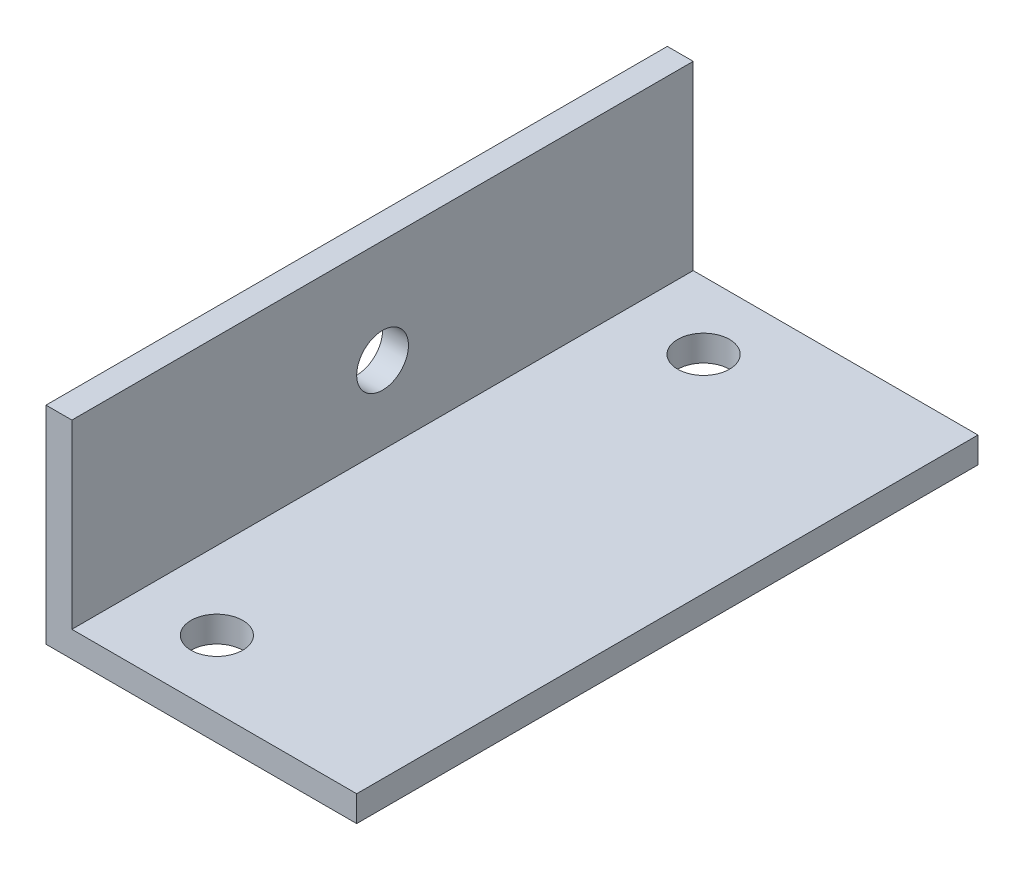
ISO-10303-21;
HEADER;
FILE_DESCRIPTION(('STEP AP214'),'2;1');
FILE_NAME('part.step','',(''),(''),'','','');
FILE_SCHEMA(('AUTOMOTIVE_DESIGN { 1 0 10303 214 1 1 1 1 }'));
ENDSEC;
DATA;
#1=APPLICATION_CONTEXT('core data for automotive mechanical design processes');
#2=APPLICATION_PROTOCOL_DEFINITION('international standard','automotive_design',2000,#1);
#3=PRODUCT_CONTEXT('',#1,'mechanical');
#4=PRODUCT('Part','Part','',(#3));
#5=PRODUCT_RELATED_PRODUCT_CATEGORY('part','',(#4));
#6=PRODUCT_DEFINITION_FORMATION('','',#4);
#7=PRODUCT_DEFINITION_CONTEXT('part definition',#1,'design');
#8=PRODUCT_DEFINITION('design','',#6,#7);
#9=PRODUCT_DEFINITION_SHAPE('','',#8);
#10=(LENGTH_UNIT() NAMED_UNIT(*) SI_UNIT(.MILLI.,.METRE.));
#11=(NAMED_UNIT(*) PLANE_ANGLE_UNIT() SI_UNIT($,.RADIAN.));
#12=(NAMED_UNIT(*) SI_UNIT($,.STERADIAN.) SOLID_ANGLE_UNIT());
#13=UNCERTAINTY_MEASURE_WITH_UNIT(LENGTH_MEASURE(1.E-05),#10,'distance_accuracy_value','');
#14=(GEOMETRIC_REPRESENTATION_CONTEXT(3) GLOBAL_UNCERTAINTY_ASSIGNED_CONTEXT((#13)) GLOBAL_UNIT_ASSIGNED_CONTEXT((#10,
#11,#12)) REPRESENTATION_CONTEXT('',''));
#15=CARTESIAN_POINT('',(0.,0.,0.));
#16=DIRECTION('',(0.,0.,1.));
#17=DIRECTION('',(1.,0.,0.));
#18=AXIS2_PLACEMENT_3D('',#15,#16,#17);
#19=CARTESIAN_POINT('',(0.,12.7,38.1));
#20=DIRECTION('',(0.,-1.,0.));
#21=DIRECTION('',(0.,0.,-1.));
#22=AXIS2_PLACEMENT_3D('',#19,#20,#21);
#23=PLANE('',#22);
#24=DIRECTION('',(-1.,0.,0.));
#25=VECTOR('',#24,1.);
#26=CARTESIAN_POINT('',(0.,12.7,0.));
#27=LINE('',#26,#25);
#28=CARTESIAN_POINT('',(1.5875,12.7,0.));
#29=VERTEX_POINT('',#28);
#30=CARTESIAN_POINT('',(0.,12.7,0.));
#31=VERTEX_POINT('',#30);
#32=EDGE_CURVE('E119',#29,#31,#27,.T.);
#33=ORIENTED_EDGE('',*,*,#32,.T.);
#34=DIRECTION('',(0.,0.,-1.));
#35=VECTOR('',#34,1.);
#36=CARTESIAN_POINT('',(0.,12.7,38.1));
#37=LINE('',#36,#35);
#38=CARTESIAN_POINT('',(0.,12.7,38.1));
#39=VERTEX_POINT('',#38);
#40=EDGE_CURVE('E11',#39,#31,#37,.T.);
#41=ORIENTED_EDGE('',*,*,#40,.F.);
#42=DIRECTION('',(-1.,0.,0.));
#43=VECTOR('',#42,1.);
#44=CARTESIAN_POINT('',(0.,12.7,38.1));
#45=LINE('',#44,#43);
#46=CARTESIAN_POINT('',(1.5875,12.7,38.1));
#47=VERTEX_POINT('',#46);
#48=EDGE_CURVE('E130',#47,#39,#45,.T.);
#49=ORIENTED_EDGE('',*,*,#48,.F.);
#50=DIRECTION('',(0.,0.,-1.));
#51=VECTOR('',#50,1.);
#52=CARTESIAN_POINT('',(1.5875,12.7,38.1));
#53=LINE('',#52,#51);
#54=EDGE_CURVE('E115',#47,#29,#53,.T.);
#55=ORIENTED_EDGE('',*,*,#54,.T.);
#56=EDGE_LOOP('',(#33,#41,#49,#55));
#57=FACE_BOUND('',#56,.T.);
#58=ADVANCED_FACE('F33',(#57),#23,.F.);
#59=CARTESIAN_POINT('',(0.,12.7,38.1));
#60=DIRECTION('',(1.,0.,0.));
#61=DIRECTION('',(0.,1.,0.));
#62=AXIS2_PLACEMENT_3D('',#59,#60,#61);
#63=PLANE('',#62);
#64=CARTESIAN_POINT('',(0.,6.35,19.05));
#65=DIRECTION('',(-1.,0.,0.));
#66=DIRECTION('',(0.,-1.,0.));
#67=AXIS2_PLACEMENT_3D('',#64,#65,#66);
#68=CIRCLE('',#67,1.5875);
#69=CARTESIAN_POINT('',(0.,4.7625,19.05));
#70=VERTEX_POINT('',#69);
#71=EDGE_CURVE('E137',#70,#70,#68,.T.);
#72=ORIENTED_EDGE('',*,*,#71,.F.);
#73=EDGE_LOOP('',(#72));
#74=FACE_BOUND('',#73,.T.);
#75=DIRECTION('',(0.,-1.,0.));
#76=VECTOR('',#75,1.);
#77=CARTESIAN_POINT('',(0.,12.7,0.));
#78=LINE('',#77,#76);
#79=CARTESIAN_POINT('',(0.,0.,0.));
#80=VERTEX_POINT('',#79);
#81=EDGE_CURVE('E122',#31,#80,#78,.T.);
#82=ORIENTED_EDGE('',*,*,#81,.T.);
#83=DIRECTION('',(0.,0.,-1.));
#84=VECTOR('',#83,1.);
#85=CARTESIAN_POINT('',(0.,0.,38.1));
#86=LINE('',#85,#84);
#87=CARTESIAN_POINT('',(0.,0.,38.1));
#88=VERTEX_POINT('',#87);
#89=EDGE_CURVE('E42',#88,#80,#86,.T.);
#90=ORIENTED_EDGE('',*,*,#89,.F.);
#91=DIRECTION('',(0.,-1.,0.));
#92=VECTOR('',#91,1.);
#93=CARTESIAN_POINT('',(0.,12.7,38.1));
#94=LINE('',#93,#92);
#95=EDGE_CURVE('E88',#39,#88,#94,.T.);
#96=ORIENTED_EDGE('',*,*,#95,.F.);
#97=ORIENTED_EDGE('',*,*,#40,.T.);
#98=EDGE_LOOP('',(#82,#90,#96,#97));
#99=FACE_BOUND('',#98,.T.);
#100=ADVANCED_FACE('F156',(#74,#99),#63,.F.);
#101=CARTESIAN_POINT('',(0.,0.,38.1));
#102=DIRECTION('',(0.,1.,0.));
#103=DIRECTION('',(0.,0.,1.));
#104=AXIS2_PLACEMENT_3D('',#101,#102,#103);
#105=PLANE('',#104);
#106=CARTESIAN_POINT('',(6.35,0.,33.9725));
#107=DIRECTION('',(0.,-1.,0.));
#108=DIRECTION('',(0.,0.,1.));
#109=AXIS2_PLACEMENT_3D('',#106,#107,#108);
#110=CIRCLE('',#109,1.5875);
#111=CARTESIAN_POINT('',(6.35,0.,35.56));
#112=VERTEX_POINT('',#111);
#113=EDGE_CURVE('E150',#112,#112,#110,.T.);
#114=ORIENTED_EDGE('',*,*,#113,.F.);
#115=EDGE_LOOP('',(#114));
#116=FACE_BOUND('',#115,.T.);
#117=CARTESIAN_POINT('',(6.35,0.,4.1275));
#118=DIRECTION('',(0.,-1.,0.));
#119=DIRECTION('',(0.,0.,-1.));
#120=AXIS2_PLACEMENT_3D('',#117,#118,#119);
#121=CIRCLE('',#120,1.58750000000001);
#122=CARTESIAN_POINT('',(6.35,0.,2.54));
#123=VERTEX_POINT('',#122);
#124=EDGE_CURVE('E140',#123,#123,#121,.T.);
#125=ORIENTED_EDGE('',*,*,#124,.F.);
#126=EDGE_LOOP('',(#125));
#127=FACE_BOUND('',#126,.T.);
#128=DIRECTION('',(1.,0.,0.));
#129=VECTOR('',#128,1.);
#130=CARTESIAN_POINT('',(0.,0.,0.));
#131=LINE('',#130,#129);
#132=CARTESIAN_POINT('',(19.05,0.,0.));
#133=VERTEX_POINT('',#132);
#134=EDGE_CURVE('E125',#80,#133,#131,.T.);
#135=ORIENTED_EDGE('',*,*,#134,.T.);
#136=DIRECTION('',(0.,0.,-1.));
#137=VECTOR('',#136,1.);
#138=CARTESIAN_POINT('',(19.05,0.,38.1));
#139=LINE('',#138,#137);
#140=CARTESIAN_POINT('',(19.05,0.,38.1));
#141=VERTEX_POINT('',#140);
#142=EDGE_CURVE('E110',#141,#133,#139,.T.);
#143=ORIENTED_EDGE('',*,*,#142,.F.);
#144=DIRECTION('',(1.,0.,0.));
#145=VECTOR('',#144,1.);
#146=CARTESIAN_POINT('',(0.,0.,38.1));
#147=LINE('',#146,#145);
#148=EDGE_CURVE('E101',#88,#141,#147,.T.);
#149=ORIENTED_EDGE('',*,*,#148,.F.);
#150=ORIENTED_EDGE('',*,*,#89,.T.);
#151=EDGE_LOOP('',(#135,#143,#149,#150));
#152=FACE_BOUND('',#151,.T.);
#153=ADVANCED_FACE('F159',(#116,#127,#152),#105,.F.);
#154=CARTESIAN_POINT('',(19.05,1.5875,38.1));
#155=DIRECTION('',(-1.,0.,0.));
#156=DIRECTION('',(0.,0.,1.));
#157=AXIS2_PLACEMENT_3D('',#154,#155,#156);
#158=PLANE('',#157);
#159=DIRECTION('',(0.,1.,0.));
#160=VECTOR('',#159,1.);
#161=CARTESIAN_POINT('',(19.05,1.5875,0.));
#162=LINE('',#161,#160);
#163=CARTESIAN_POINT('',(19.05,1.5875,0.));
#164=VERTEX_POINT('',#163);
#165=EDGE_CURVE('E109',#133,#164,#162,.T.);
#166=ORIENTED_EDGE('',*,*,#165,.T.);
#167=DIRECTION('',(0.,0.,-1.));
#168=VECTOR('',#167,1.);
#169=CARTESIAN_POINT('',(19.05,1.5875,38.1));
#170=LINE('',#169,#168);
#171=CARTESIAN_POINT('',(19.05,1.5875,38.1));
#172=VERTEX_POINT('',#171);
#173=EDGE_CURVE('E106',#172,#164,#170,.T.);
#174=ORIENTED_EDGE('',*,*,#173,.F.);
#175=DIRECTION('',(0.,1.,0.));
#176=VECTOR('',#175,1.);
#177=CARTESIAN_POINT('',(19.05,1.5875,38.1));
#178=LINE('',#177,#176);
#179=EDGE_CURVE('E95',#141,#172,#178,.T.);
#180=ORIENTED_EDGE('',*,*,#179,.F.);
#181=ORIENTED_EDGE('',*,*,#142,.T.);
#182=EDGE_LOOP('',(#166,#174,#180,#181));
#183=FACE_BOUND('',#182,.T.);
#184=ADVANCED_FACE('F107',(#183),#158,.F.);
#185=CARTESIAN_POINT('',(1.5875,1.5875,38.1));
#186=DIRECTION('',(0.,-1.,0.));
#187=DIRECTION('',(0.,0.,-1.));
#188=AXIS2_PLACEMENT_3D('',#185,#186,#187);
#189=PLANE('',#188);
#190=CARTESIAN_POINT('',(6.35,1.5875,33.9725));
#191=DIRECTION('',(0.,-1.,0.));
#192=DIRECTION('',(0.,0.,-1.));
#193=AXIS2_PLACEMENT_3D('',#190,#191,#192);
#194=CIRCLE('',#193,1.5875);
#195=CARTESIAN_POINT('',(6.35,1.5875,32.385));
#196=VERTEX_POINT('',#195);
#197=EDGE_CURVE('E36',#196,#196,#194,.T.);
#198=ORIENTED_EDGE('',*,*,#197,.T.);
#199=EDGE_LOOP('',(#198));
#200=FACE_BOUND('',#199,.T.);
#201=CARTESIAN_POINT('',(6.35,1.5875,4.1275));
#202=DIRECTION('',(0.,-1.,0.));
#203=DIRECTION('',(0.,0.,-1.));
#204=AXIS2_PLACEMENT_3D('',#201,#202,#203);
#205=CIRCLE('',#204,1.58750000000001);
#206=CARTESIAN_POINT('',(6.35,1.5875,2.54));
#207=VERTEX_POINT('',#206);
#208=EDGE_CURVE('E138',#207,#207,#205,.T.);
#209=ORIENTED_EDGE('',*,*,#208,.T.);
#210=EDGE_LOOP('',(#209));
#211=FACE_BOUND('',#210,.T.);
#212=DIRECTION('',(-1.,0.,0.));
#213=VECTOR('',#212,1.);
#214=CARTESIAN_POINT('',(1.5875,1.5875,0.));
#215=LINE('',#214,#213);
#216=CARTESIAN_POINT('',(1.5875,1.5875,0.));
#217=VERTEX_POINT('',#216);
#218=EDGE_CURVE('E74',#164,#217,#215,.T.);
#219=ORIENTED_EDGE('',*,*,#218,.T.);
#220=DIRECTION('',(0.,0.,-1.));
#221=VECTOR('',#220,1.);
#222=CARTESIAN_POINT('',(1.5875,1.5875,38.1));
#223=LINE('',#222,#221);
#224=CARTESIAN_POINT('',(1.5875,1.5875,38.1));
#225=VERTEX_POINT('',#224);
#226=EDGE_CURVE('E111',#225,#217,#223,.T.);
#227=ORIENTED_EDGE('',*,*,#226,.F.);
#228=DIRECTION('',(-1.,0.,0.));
#229=VECTOR('',#228,1.);
#230=CARTESIAN_POINT('',(1.5875,1.5875,38.1));
#231=LINE('',#230,#229);
#232=EDGE_CURVE('E99',#172,#225,#231,.T.);
#233=ORIENTED_EDGE('',*,*,#232,.F.);
#234=ORIENTED_EDGE('',*,*,#173,.T.);
#235=EDGE_LOOP('',(#219,#227,#233,#234));
#236=FACE_BOUND('',#235,.T.);
#237=ADVANCED_FACE('F113',(#200,#211,#236),#189,.F.);
#238=CARTESIAN_POINT('',(1.5875,12.7,38.1));
#239=DIRECTION('',(-1.,0.,0.));
#240=DIRECTION('',(0.,-1.,0.));
#241=AXIS2_PLACEMENT_3D('',#238,#239,#240);
#242=PLANE('',#241);
#243=CARTESIAN_POINT('',(1.5875,6.35,19.05));
#244=DIRECTION('',(-1.,0.,0.));
#245=DIRECTION('',(0.,-1.,0.));
#246=AXIS2_PLACEMENT_3D('',#243,#244,#245);
#247=CIRCLE('',#246,1.5875);
#248=CARTESIAN_POINT('',(1.58750000000001,4.7625,19.05));
#249=VERTEX_POINT('',#248);
#250=EDGE_CURVE('E123',#249,#249,#247,.T.);
#251=ORIENTED_EDGE('',*,*,#250,.T.);
#252=EDGE_LOOP('',(#251));
#253=FACE_BOUND('',#252,.T.);
#254=DIRECTION('',(0.,1.,0.));
#255=VECTOR('',#254,1.);
#256=CARTESIAN_POINT('',(1.5875,12.7,0.));
#257=LINE('',#256,#255);
#258=EDGE_CURVE('E80',#217,#29,#257,.T.);
#259=ORIENTED_EDGE('',*,*,#258,.T.);
#260=ORIENTED_EDGE('',*,*,#54,.F.);
#261=DIRECTION('',(0.,1.,0.));
#262=VECTOR('',#261,1.);
#263=CARTESIAN_POINT('',(1.5875,12.7,38.1));
#264=LINE('',#263,#262);
#265=EDGE_CURVE('E51',#225,#47,#264,.T.);
#266=ORIENTED_EDGE('',*,*,#265,.F.);
#267=ORIENTED_EDGE('',*,*,#226,.T.);
#268=EDGE_LOOP('',(#259,#260,#266,#267));
#269=FACE_BOUND('',#268,.T.);
#270=ADVANCED_FACE('F164',(#253,#269),#242,.F.);
#271=CARTESIAN_POINT('',(1.5875,12.7,38.1));
#272=DIRECTION('',(0.,0.,-1.));
#273=DIRECTION('',(-1.,0.,0.));
#274=AXIS2_PLACEMENT_3D('',#271,#272,#273);
#275=PLANE('',#274);
#276=ORIENTED_EDGE('',*,*,#48,.T.);
#277=ORIENTED_EDGE('',*,*,#95,.T.);
#278=ORIENTED_EDGE('',*,*,#148,.T.);
#279=ORIENTED_EDGE('',*,*,#179,.T.);
#280=ORIENTED_EDGE('',*,*,#232,.T.);
#281=ORIENTED_EDGE('',*,*,#265,.T.);
#282=EDGE_LOOP('',(#276,#277,#278,#279,#280,#281));
#283=FACE_BOUND('',#282,.T.);
#284=ADVANCED_FACE('F97',(#283),#275,.F.);
#285=CARTESIAN_POINT('',(1.5875,12.7,0.));
#286=DIRECTION('',(0.,0.,-1.));
#287=DIRECTION('',(-1.,0.,0.));
#288=AXIS2_PLACEMENT_3D('',#285,#286,#287);
#289=PLANE('',#288);
#290=ORIENTED_EDGE('',*,*,#32,.F.);
#291=ORIENTED_EDGE('',*,*,#258,.F.);
#292=ORIENTED_EDGE('',*,*,#218,.F.);
#293=ORIENTED_EDGE('',*,*,#165,.F.);
#294=ORIENTED_EDGE('',*,*,#134,.F.);
#295=ORIENTED_EDGE('',*,*,#81,.F.);
#296=EDGE_LOOP('',(#290,#291,#292,#293,#294,#295));
#297=FACE_BOUND('',#296,.T.);
#298=ADVANCED_FACE('F162',(#297),#289,.T.);
#299=CARTESIAN_POINT('',(19.05,6.35,19.05));
#300=DIRECTION('',(-1.,0.,0.));
#301=DIRECTION('',(0.,-1.,0.));
#302=AXIS2_PLACEMENT_3D('',#299,#300,#301);
#303=CYLINDRICAL_SURFACE('',#302,1.5875);
#304=CARTESIAN_POINT('',(0.,4.7625,19.05));
#305=CARTESIAN_POINT('',(0.016536458333333,4.7625,19.05));
#306=CARTESIAN_POINT('',(0.0330729166666659,4.7625,19.05));
#307=CARTESIAN_POINT('',(0.066145833333333,4.7625,19.05));
#308=CARTESIAN_POINT('',(0.0826822916666671,4.7625,19.05));
#309=CARTESIAN_POINT('',(0.115755208333334,4.7625,19.05));
#310=CARTESIAN_POINT('',(0.132291666666667,4.7625,19.05));
#311=CARTESIAN_POINT('',(0.165364583333334,4.7625,19.05));
#312=CARTESIAN_POINT('',(0.181901041666668,4.7625,19.05));
#313=CARTESIAN_POINT('',(0.214973958333335,4.7625,19.05));
#314=CARTESIAN_POINT('',(0.231510416666668,4.7625,19.05));
#315=CARTESIAN_POINT('',(0.264583333333334,4.7625,19.05));
#316=CARTESIAN_POINT('',(0.281119791666667,4.7625,19.05));
#317=CARTESIAN_POINT('',(0.314192708333334,4.7625,19.05));
#318=CARTESIAN_POINT('',(0.330729166666668,4.7625,19.05));
#319=CARTESIAN_POINT('',(0.363802083333335,4.7625,19.05));
#320=CARTESIAN_POINT('',(0.380338541666668,4.7625,19.05));
#321=CARTESIAN_POINT('',(0.413411458333334,4.7625,19.05));
#322=CARTESIAN_POINT('',(0.429947916666667,4.7625,19.05));
#323=CARTESIAN_POINT('',(0.463020833333334,4.7625,19.05));
#324=CARTESIAN_POINT('',(0.479557291666668,4.7625,19.05));
#325=CARTESIAN_POINT('',(0.512630208333336,4.7625,19.05));
#326=CARTESIAN_POINT('',(0.529166666666669,4.7625,19.05));
#327=CARTESIAN_POINT('',(0.562239583333334,4.7625,19.05));
#328=CARTESIAN_POINT('',(0.578776041666667,4.7625,19.05));
#329=CARTESIAN_POINT('',(0.611848958333334,4.7625,19.05));
#330=CARTESIAN_POINT('',(0.628385416666669,4.7625,19.05));
#331=CARTESIAN_POINT('',(0.661458333333336,4.7625,19.05));
#332=CARTESIAN_POINT('',(0.677994791666669,4.7625,19.05));
#333=CARTESIAN_POINT('',(0.711067708333336,4.7625,19.05));
#334=CARTESIAN_POINT('',(0.72760416666667,4.7625,19.05));
#335=CARTESIAN_POINT('',(0.760677083333337,4.7625,19.05));
#336=CARTESIAN_POINT('',(0.77721354166667,4.7625,19.05));
#337=CARTESIAN_POINT('',(0.810286458333336,4.7625,19.05));
#338=CARTESIAN_POINT('',(0.826822916666669,4.7625,19.05));
#339=CARTESIAN_POINT('',(0.859895833333336,4.7625,19.05));
#340=CARTESIAN_POINT('',(0.87643229166667,4.7625,19.05));
#341=CARTESIAN_POINT('',(0.909505208333337,4.7625,19.05));
#342=CARTESIAN_POINT('',(0.92604166666667,4.7625,19.05));
#343=CARTESIAN_POINT('',(0.959114583333337,4.7625,19.05));
#344=CARTESIAN_POINT('',(0.975651041666671,4.7625,19.05));
#345=CARTESIAN_POINT('',(1.00872395833334,4.7625,19.05));
#346=CARTESIAN_POINT('',(1.02526041666667,4.7625,19.05));
#347=CARTESIAN_POINT('',(1.05833333333334,4.7625,19.05));
#348=CARTESIAN_POINT('',(1.07486979166667,4.7625,19.05));
#349=CARTESIAN_POINT('',(1.10794270833334,4.7625,19.05));
#350=CARTESIAN_POINT('',(1.12447916666667,4.7625,19.05));
#351=CARTESIAN_POINT('',(1.15755208333334,4.7625,19.05));
#352=CARTESIAN_POINT('',(1.17408854166667,4.7625,19.05));
#353=CARTESIAN_POINT('',(1.20716145833334,4.7625,19.05));
#354=CARTESIAN_POINT('',(1.22369791666667,4.7625,19.05));
#355=CARTESIAN_POINT('',(1.25677083333334,4.7625,19.05));
#356=CARTESIAN_POINT('',(1.27330729166667,4.7625,19.05));
#357=CARTESIAN_POINT('',(1.30638020833334,4.7625,19.05));
#358=CARTESIAN_POINT('',(1.32291666666667,4.7625,19.05));
#359=CARTESIAN_POINT('',(1.35598958333334,4.7625,19.05));
#360=CARTESIAN_POINT('',(1.37252604166667,4.7625,19.05));
#361=CARTESIAN_POINT('',(1.40559895833334,4.7625,19.05));
#362=CARTESIAN_POINT('',(1.42213541666667,4.7625,19.05));
#363=CARTESIAN_POINT('',(1.45520833333334,4.7625,19.05));
#364=CARTESIAN_POINT('',(1.47174479166667,4.7625,19.05));
#365=CARTESIAN_POINT('',(1.50481770833334,4.7625,19.05));
#366=CARTESIAN_POINT('',(1.52135416666667,4.7625,19.05));
#367=CARTESIAN_POINT('',(1.55442708333334,4.7625,19.05));
#368=CARTESIAN_POINT('',(1.57096354166667,4.7625,19.05));
#369=CARTESIAN_POINT('',(1.58750000000001,4.7625,19.05));
#370=B_SPLINE_CURVE_WITH_KNOTS('',3,(#304,#305,#306,#307,#308,#309,#310,#311,#312,#313,#314,
#315,#316,#317,#318,#319,#320,#321,#322,#323,#324,#325,#326,#327,#328,#329,#330,#331,#332,#333,
#334,#335,#336,#337,#338,#339,#340,#341,#342,#343,#344,#345,#346,#347,#348,#349,#350,#351,#352,
#353,#354,#355,#356,#357,#358,#359,#360,#361,#362,#363,#364,#365,#366,#367,#368,#369),
.UNSPECIFIED.,.F.,.F.,(4,2,2,2,2,2,2,2,2,2,2,2,2,2,2,2,2,2,2,2,2,2,2,2,2,2,2,2,2,2,2,2,4),(0.,
0.0496093749999989,0.0992187500000012,0.148828125,0.198437500000002,0.248046875000001,
0.29765625,0.347265625000003,0.396875000000001,0.446484375,0.496093750000003,0.545703125000002,
0.5953125,0.644921875000003,0.694531250000002,0.744140625000004,0.793750000000003,
0.843359375000002,0.892968750000004,0.942578125000003,0.992187500000005,1.041796875,1.09140625,
1.14101562500001,1.190625,1.240234375,1.28984375000001,1.339453125,1.3890625,1.43867187500001,
1.48828125,1.53789062500001,1.58750000000001),.UNSPECIFIED.);
#371=EDGE_CURVE('BSEAM214',#70,#249,#370,.T.);
#372=ORIENTED_EDGE('',*,*,#71,.T.);
#373=ORIENTED_EDGE('',*,*,#250,.F.);
#374=ORIENTED_EDGE('',*,*,#371,.T.);
#375=ORIENTED_EDGE('',*,*,#371,.F.);
#376=EDGE_LOOP('',(#372,#374,#373,#375));
#377=FACE_BOUND('',#376,.T.);
#378=ADVANCED_FACE('F214',(#377),#303,.F.);
#379=CARTESIAN_POINT('',(6.35,12.7,4.1275));
#380=DIRECTION('',(0.,-1.,0.));
#381=DIRECTION('',(0.,0.,-1.));
#382=AXIS2_PLACEMENT_3D('',#379,#380,#381);
#383=CYLINDRICAL_SURFACE('',#382,1.58750000000001);
#384=ORIENTED_EDGE('',*,*,#124,.T.);
#385=EDGE_LOOP('',(#384));
#386=FACE_BOUND('',#385,.T.);
#387=ORIENTED_EDGE('',*,*,#208,.F.);
#388=EDGE_LOOP('',(#387));
#389=FACE_BOUND('',#388,.T.);
#390=ADVANCED_FACE('F208',(#386,#389),#383,.F.);
#391=CARTESIAN_POINT('',(6.35,12.7,33.9725));
#392=DIRECTION('',(0.,-1.,0.));
#393=DIRECTION('',(0.,0.,-1.));
#394=AXIS2_PLACEMENT_3D('',#391,#392,#393);
#395=CYLINDRICAL_SURFACE('',#394,1.5875);
#396=ORIENTED_EDGE('',*,*,#113,.T.);
#397=EDGE_LOOP('',(#396));
#398=FACE_BOUND('',#397,.T.);
#399=ORIENTED_EDGE('',*,*,#197,.F.);
#400=EDGE_LOOP('',(#399));
#401=FACE_BOUND('',#400,.T.);
#402=ADVANCED_FACE('F213',(#398,#401),#395,.F.);
#403=CLOSED_SHELL('',(#58,#100,#153,#184,#237,#270,#284,#298,#378,#390,#402));
#404=MANIFOLD_SOLID_BREP('B2',#403);
#405=ADVANCED_BREP_SHAPE_REPRESENTATION('',(#18,#404),#14);
#406=SHAPE_DEFINITION_REPRESENTATION(#9,#405);
ENDSEC;
END-ISO-10303-21;
